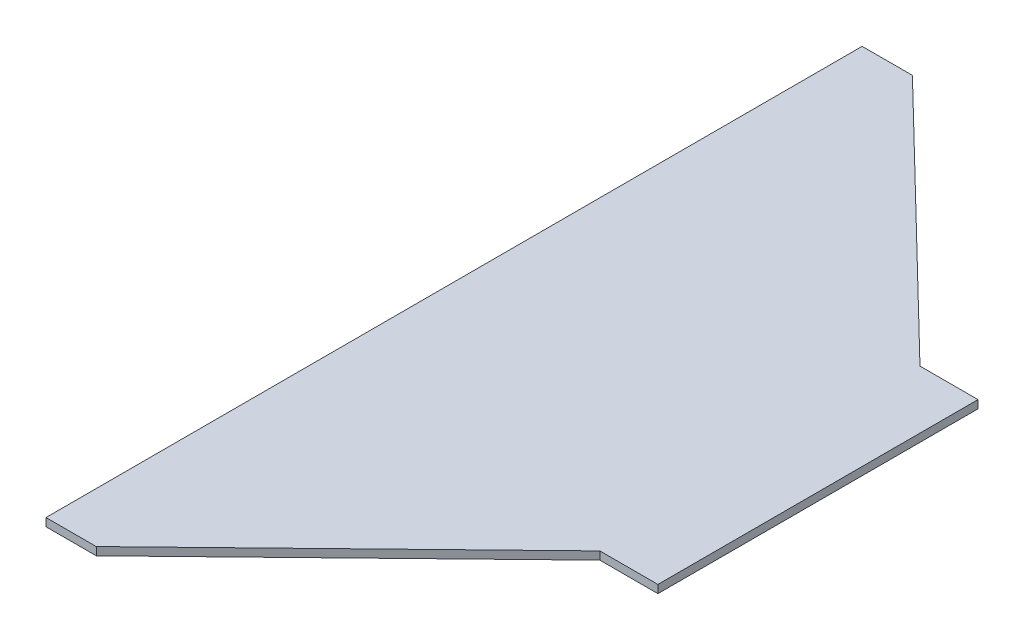
ISO-10303-21;
HEADER;
FILE_DESCRIPTION(('STEP AP214'),'2;1');
FILE_NAME('part.step','',(''),(''),'','','');
FILE_SCHEMA(('AUTOMOTIVE_DESIGN { 1 0 10303 214 1 1 1 1 }'));
ENDSEC;
DATA;
#1=APPLICATION_CONTEXT('core data for automotive mechanical design processes');
#2=APPLICATION_PROTOCOL_DEFINITION('international standard','automotive_design',2000,#1);
#3=PRODUCT_CONTEXT('',#1,'mechanical');
#4=PRODUCT('Part','Part','',(#3));
#5=PRODUCT_RELATED_PRODUCT_CATEGORY('part','',(#4));
#6=PRODUCT_DEFINITION_FORMATION('','',#4);
#7=PRODUCT_DEFINITION_CONTEXT('part definition',#1,'design');
#8=PRODUCT_DEFINITION('design','',#6,#7);
#9=PRODUCT_DEFINITION_SHAPE('','',#8);
#10=(LENGTH_UNIT() NAMED_UNIT(*) SI_UNIT(.MILLI.,.METRE.));
#11=(NAMED_UNIT(*) PLANE_ANGLE_UNIT() SI_UNIT($,.RADIAN.));
#12=(NAMED_UNIT(*) SI_UNIT($,.STERADIAN.) SOLID_ANGLE_UNIT());
#13=UNCERTAINTY_MEASURE_WITH_UNIT(LENGTH_MEASURE(1.E-05),#10,'distance_accuracy_value','');
#14=(GEOMETRIC_REPRESENTATION_CONTEXT(3) GLOBAL_UNCERTAINTY_ASSIGNED_CONTEXT((#13)) GLOBAL_UNIT_ASSIGNED_CONTEXT((#10,
#11,#12)) REPRESENTATION_CONTEXT('',''));
#15=CARTESIAN_POINT('',(0.,0.,0.));
#16=DIRECTION('',(0.,0.,1.));
#17=DIRECTION('',(1.,0.,0.));
#18=AXIS2_PLACEMENT_3D('',#15,#16,#17);
#19=CARTESIAN_POINT('',(6.27,1.,0.));
#20=DIRECTION('',(0.,0.,1.));
#21=DIRECTION('',(1.,0.,0.));
#22=AXIS2_PLACEMENT_3D('',#19,#20,#21);
#23=PLANE('',#22);
#24=DIRECTION('',(-1.,0.,0.));
#25=VECTOR('',#24,1.);
#26=CARTESIAN_POINT('',(6.27,0.,0.));
#27=LINE('',#26,#25);
#28=CARTESIAN_POINT('',(6.27,0.,0.));
#29=VERTEX_POINT('',#28);
#30=CARTESIAN_POINT('',(0.,0.,0.));
#31=VERTEX_POINT('',#30);
#32=EDGE_CURVE('E134',#29,#31,#27,.T.);
#33=ORIENTED_EDGE('',*,*,#32,.T.);
#34=DIRECTION('',(0.,-1.,0.));
#35=VECTOR('',#34,1.);
#36=CARTESIAN_POINT('',(0.,1.,0.));
#37=LINE('',#36,#35);
#38=CARTESIAN_POINT('',(0.,1.,0.));
#39=VERTEX_POINT('',#38);
#40=EDGE_CURVE('E11',#39,#31,#37,.T.);
#41=ORIENTED_EDGE('',*,*,#40,.F.);
#42=DIRECTION('',(-1.,0.,0.));
#43=VECTOR('',#42,1.);
#44=CARTESIAN_POINT('',(6.27,1.,0.));
#45=LINE('',#44,#43);
#46=CARTESIAN_POINT('',(6.27,1.,0.));
#47=VERTEX_POINT('',#46);
#48=EDGE_CURVE('E149',#47,#39,#45,.T.);
#49=ORIENTED_EDGE('',*,*,#48,.F.);
#50=DIRECTION('',(0.,-1.,0.));
#51=VECTOR('',#50,1.);
#52=CARTESIAN_POINT('',(6.27,1.,0.));
#53=LINE('',#52,#51);
#54=EDGE_CURVE('E131',#47,#29,#53,.T.);
#55=ORIENTED_EDGE('',*,*,#54,.T.);
#56=EDGE_LOOP('',(#33,#41,#49,#55));
#57=FACE_BOUND('',#56,.T.);
#58=ADVANCED_FACE('F39',(#57),#23,.F.);
#59=CARTESIAN_POINT('',(0.,1.,0.));
#60=DIRECTION('',(1.,0.,0.));
#61=DIRECTION('',(0.,0.,-1.));
#62=AXIS2_PLACEMENT_3D('',#59,#60,#61);
#63=PLANE('',#62);
#64=DIRECTION('',(0.,0.,1.));
#65=VECTOR('',#64,1.);
#66=CARTESIAN_POINT('',(0.,0.,0.));
#67=LINE('',#66,#65);
#68=CARTESIAN_POINT('',(0.,0.,101.83));
#69=VERTEX_POINT('',#68);
#70=EDGE_CURVE('E137',#31,#69,#67,.T.);
#71=ORIENTED_EDGE('',*,*,#70,.T.);
#72=DIRECTION('',(0.,-1.,0.));
#73=VECTOR('',#72,1.);
#74=CARTESIAN_POINT('',(0.,1.,101.83));
#75=LINE('',#74,#73);
#76=CARTESIAN_POINT('',(0.,1.,101.83));
#77=VERTEX_POINT('',#76);
#78=EDGE_CURVE('E50',#77,#69,#75,.T.);
#79=ORIENTED_EDGE('',*,*,#78,.F.);
#80=DIRECTION('',(0.,0.,1.));
#81=VECTOR('',#80,1.);
#82=CARTESIAN_POINT('',(0.,1.,0.));
#83=LINE('',#82,#81);
#84=EDGE_CURVE('E98',#39,#77,#83,.T.);
#85=ORIENTED_EDGE('',*,*,#84,.F.);
#86=ORIENTED_EDGE('',*,*,#40,.T.);
#87=EDGE_LOOP('',(#71,#79,#85,#86));
#88=FACE_BOUND('',#87,.T.);
#89=ADVANCED_FACE('F184',(#88),#63,.F.);
#90=CARTESIAN_POINT('',(0.,1.,101.83));
#91=DIRECTION('',(0.,0.,-1.));
#92=DIRECTION('',(-1.,0.,0.));
#93=AXIS2_PLACEMENT_3D('',#90,#91,#92);
#94=PLANE('',#93);
#95=DIRECTION('',(1.,0.,0.));
#96=VECTOR('',#95,1.);
#97=CARTESIAN_POINT('',(0.,0.,101.83));
#98=LINE('',#97,#96);
#99=CARTESIAN_POINT('',(6.27,0.,101.83));
#100=VERTEX_POINT('',#99);
#101=EDGE_CURVE('E139',#69,#100,#98,.T.);
#102=ORIENTED_EDGE('',*,*,#101,.T.);
#103=DIRECTION('',(0.,-1.,0.));
#104=VECTOR('',#103,1.);
#105=CARTESIAN_POINT('',(6.27,1.,101.83));
#106=LINE('',#105,#104);
#107=CARTESIAN_POINT('',(6.27,1.,101.83));
#108=VERTEX_POINT('',#107);
#109=EDGE_CURVE('E156',#108,#100,#106,.T.);
#110=ORIENTED_EDGE('',*,*,#109,.F.);
#111=DIRECTION('',(1.,0.,0.));
#112=VECTOR('',#111,1.);
#113=CARTESIAN_POINT('',(0.,1.,101.83));
#114=LINE('',#113,#112);
#115=EDGE_CURVE('E163',#77,#108,#114,.T.);
#116=ORIENTED_EDGE('',*,*,#115,.F.);
#117=ORIENTED_EDGE('',*,*,#78,.T.);
#118=EDGE_LOOP('',(#102,#110,#116,#117));
#119=FACE_BOUND('',#118,.T.);
#120=ADVANCED_FACE('F165',(#119),#94,.F.);
#121=CARTESIAN_POINT('',(6.27,1.,101.83));
#122=DIRECTION('',(-0.696393575510658,0.,-0.717660078301337));
#123=DIRECTION('',(-0.717660078301337,0.,0.696393575510658));
#124=AXIS2_PLACEMENT_3D('',#121,#122,#123);
#125=PLANE('',#124);
#126=DIRECTION('',(0.717660078301337,0.,-0.696393575510658));
#127=VECTOR('',#126,1.);
#128=CARTESIAN_POINT('',(6.27,0.,101.83));
#129=LINE('',#128,#127);
#130=CARTESIAN_POINT('',(38.16,0.,70.885));
#131=VERTEX_POINT('',#130);
#132=EDGE_CURVE('E142',#100,#131,#129,.T.);
#133=ORIENTED_EDGE('',*,*,#132,.T.);
#134=DIRECTION('',(0.,-1.,0.));
#135=VECTOR('',#134,1.);
#136=CARTESIAN_POINT('',(38.16,1.,70.885));
#137=LINE('',#136,#135);
#138=CARTESIAN_POINT('',(38.16,1.,70.885));
#139=VERTEX_POINT('',#138);
#140=EDGE_CURVE('E153',#139,#131,#137,.T.);
#141=ORIENTED_EDGE('',*,*,#140,.F.);
#142=DIRECTION('',(0.717660078301337,0.,-0.696393575510658));
#143=VECTOR('',#142,1.);
#144=CARTESIAN_POINT('',(6.27,1.,101.83));
#145=LINE('',#144,#143);
#146=EDGE_CURVE('E176',#108,#139,#145,.T.);
#147=ORIENTED_EDGE('',*,*,#146,.F.);
#148=ORIENTED_EDGE('',*,*,#109,.T.);
#149=EDGE_LOOP('',(#133,#141,#147,#148));
#150=FACE_BOUND('',#149,.T.);
#151=ADVANCED_FACE('F175',(#150),#125,.F.);
#152=CARTESIAN_POINT('',(38.16,1.,70.885));
#153=DIRECTION('',(0.,0.,-1.));
#154=DIRECTION('',(-1.,0.,0.));
#155=AXIS2_PLACEMENT_3D('',#152,#153,#154);
#156=PLANE('',#155);
#157=DIRECTION('',(1.,0.,0.));
#158=VECTOR('',#157,1.);
#159=CARTESIAN_POINT('',(38.16,0.,70.885));
#160=LINE('',#159,#158);
#161=CARTESIAN_POINT('',(45.4,0.,70.885));
#162=VERTEX_POINT('',#161);
#163=EDGE_CURVE('E145',#131,#162,#160,.T.);
#164=ORIENTED_EDGE('',*,*,#163,.T.);
#165=DIRECTION('',(0.,-1.,0.));
#166=VECTOR('',#165,1.);
#167=CARTESIAN_POINT('',(45.4,1.,70.885));
#168=LINE('',#167,#166);
#169=CARTESIAN_POINT('',(45.4,1.,70.885));
#170=VERTEX_POINT('',#169);
#171=EDGE_CURVE('E127',#170,#162,#168,.T.);
#172=ORIENTED_EDGE('',*,*,#171,.F.);
#173=DIRECTION('',(1.,0.,0.));
#174=VECTOR('',#173,1.);
#175=CARTESIAN_POINT('',(38.16,1.,70.885));
#176=LINE('',#175,#174);
#177=EDGE_CURVE('E120',#139,#170,#176,.T.);
#178=ORIENTED_EDGE('',*,*,#177,.F.);
#179=ORIENTED_EDGE('',*,*,#140,.T.);
#180=EDGE_LOOP('',(#164,#172,#178,#179));
#181=FACE_BOUND('',#180,.T.);
#182=ADVANCED_FACE('F174',(#181),#156,.F.);
#183=CARTESIAN_POINT('',(45.4,1.,70.885));
#184=DIRECTION('',(-1.,0.,0.));
#185=DIRECTION('',(0.,0.,1.));
#186=AXIS2_PLACEMENT_3D('',#183,#184,#185);
#187=PLANE('',#186);
#188=DIRECTION('',(0.,0.,-1.));
#189=VECTOR('',#188,1.);
#190=CARTESIAN_POINT('',(45.4,0.,70.885));
#191=LINE('',#190,#189);
#192=CARTESIAN_POINT('',(45.4,0.,30.945));
#193=VERTEX_POINT('',#192);
#194=EDGE_CURVE('E124',#162,#193,#191,.T.);
#195=ORIENTED_EDGE('',*,*,#194,.T.);
#196=DIRECTION('',(0.,-1.,0.));
#197=VECTOR('',#196,1.);
#198=CARTESIAN_POINT('',(45.4,1.,30.945));
#199=LINE('',#198,#197);
#200=CARTESIAN_POINT('',(45.4,1.,30.945));
#201=VERTEX_POINT('',#200);
#202=EDGE_CURVE('E125',#201,#193,#199,.T.);
#203=ORIENTED_EDGE('',*,*,#202,.F.);
#204=DIRECTION('',(0.,0.,-1.));
#205=VECTOR('',#204,1.);
#206=CARTESIAN_POINT('',(45.4,1.,70.885));
#207=LINE('',#206,#205);
#208=EDGE_CURVE('E112',#170,#201,#207,.T.);
#209=ORIENTED_EDGE('',*,*,#208,.F.);
#210=ORIENTED_EDGE('',*,*,#171,.T.);
#211=EDGE_LOOP('',(#195,#203,#209,#210));
#212=FACE_BOUND('',#211,.T.);
#213=ADVANCED_FACE('F122',(#212),#187,.F.);
#214=CARTESIAN_POINT('',(45.4,1.,30.945));
#215=DIRECTION('',(0.,0.,1.));
#216=DIRECTION('',(1.,0.,0.));
#217=AXIS2_PLACEMENT_3D('',#214,#215,#216);
#218=PLANE('',#217);
#219=DIRECTION('',(-1.,0.,0.));
#220=VECTOR('',#219,1.);
#221=CARTESIAN_POINT('',(45.4,0.,30.945));
#222=LINE('',#221,#220);
#223=CARTESIAN_POINT('',(38.16,0.,30.945));
#224=VERTEX_POINT('',#223);
#225=EDGE_CURVE('E83',#193,#224,#222,.T.);
#226=ORIENTED_EDGE('',*,*,#225,.T.);
#227=DIRECTION('',(0.,-1.,0.));
#228=VECTOR('',#227,1.);
#229=CARTESIAN_POINT('',(38.16,1.,30.945));
#230=LINE('',#229,#228);
#231=CARTESIAN_POINT('',(38.16,1.,30.945));
#232=VERTEX_POINT('',#231);
#233=EDGE_CURVE('E130',#232,#224,#230,.T.);
#234=ORIENTED_EDGE('',*,*,#233,.F.);
#235=DIRECTION('',(-1.,0.,0.));
#236=VECTOR('',#235,1.);
#237=CARTESIAN_POINT('',(45.4,1.,30.945));
#238=LINE('',#237,#236);
#239=EDGE_CURVE('E113',#201,#232,#238,.T.);
#240=ORIENTED_EDGE('',*,*,#239,.F.);
#241=ORIENTED_EDGE('',*,*,#202,.T.);
#242=EDGE_LOOP('',(#226,#234,#240,#241));
#243=FACE_BOUND('',#242,.T.);
#244=ADVANCED_FACE('F129',(#243),#218,.F.);
#245=CARTESIAN_POINT('',(38.16,1.,30.945));
#246=DIRECTION('',(-0.696393575510658,0.,0.717660078301337));
#247=DIRECTION('',(0.717660078301337,0.,0.696393575510658));
#248=AXIS2_PLACEMENT_3D('',#245,#246,#247);
#249=PLANE('',#248);
#250=DIRECTION('',(-0.717660078301337,0.,-0.696393575510658));
#251=VECTOR('',#250,1.);
#252=CARTESIAN_POINT('',(38.16,0.,30.945));
#253=LINE('',#252,#251);
#254=EDGE_CURVE('E89',#224,#29,#253,.T.);
#255=ORIENTED_EDGE('',*,*,#254,.T.);
#256=ORIENTED_EDGE('',*,*,#54,.F.);
#257=DIRECTION('',(-0.717660078301337,0.,-0.696393575510658));
#258=VECTOR('',#257,1.);
#259=CARTESIAN_POINT('',(38.16,1.,30.945));
#260=LINE('',#259,#258);
#261=EDGE_CURVE('E54',#232,#47,#260,.T.);
#262=ORIENTED_EDGE('',*,*,#261,.F.);
#263=ORIENTED_EDGE('',*,*,#233,.T.);
#264=EDGE_LOOP('',(#255,#256,#262,#263));
#265=FACE_BOUND('',#264,.T.);
#266=ADVANCED_FACE('F199',(#265),#249,.F.);
#267=CARTESIAN_POINT('',(0.,1.,0.));
#268=DIRECTION('',(0.,1.,0.));
#269=DIRECTION('',(0.,0.,1.));
#270=AXIS2_PLACEMENT_3D('',#267,#268,#269);
#271=PLANE('',#270);
#272=ORIENTED_EDGE('',*,*,#48,.T.);
#273=ORIENTED_EDGE('',*,*,#84,.T.);
#274=ORIENTED_EDGE('',*,*,#115,.T.);
#275=ORIENTED_EDGE('',*,*,#146,.T.);
#276=ORIENTED_EDGE('',*,*,#177,.T.);
#277=ORIENTED_EDGE('',*,*,#208,.T.);
#278=ORIENTED_EDGE('',*,*,#239,.T.);
#279=ORIENTED_EDGE('',*,*,#261,.T.);
#280=EDGE_LOOP('',(#272,#273,#274,#275,#276,#277,#278,#279));
#281=FACE_BOUND('',#280,.T.);
#282=ADVANCED_FACE('F114',(#281),#271,.T.);
#283=CARTESIAN_POINT('',(0.,0.,0.));
#284=DIRECTION('',(0.,1.,0.));
#285=DIRECTION('',(0.,0.,1.));
#286=AXIS2_PLACEMENT_3D('',#283,#284,#285);
#287=PLANE('',#286);
#288=ORIENTED_EDGE('',*,*,#32,.F.);
#289=ORIENTED_EDGE('',*,*,#254,.F.);
#290=ORIENTED_EDGE('',*,*,#225,.F.);
#291=ORIENTED_EDGE('',*,*,#194,.F.);
#292=ORIENTED_EDGE('',*,*,#163,.F.);
#293=ORIENTED_EDGE('',*,*,#132,.F.);
#294=ORIENTED_EDGE('',*,*,#101,.F.);
#295=ORIENTED_EDGE('',*,*,#70,.F.);
#296=EDGE_LOOP('',(#288,#289,#290,#291,#292,#293,#294,#295));
#297=FACE_BOUND('',#296,.T.);
#298=ADVANCED_FACE('F169',(#297),#287,.F.);
#299=CLOSED_SHELL('',(#58,#89,#120,#151,#182,#213,#244,#266,#282,#298));
#300=MANIFOLD_SOLID_BREP('B2',#299);
#301=ADVANCED_BREP_SHAPE_REPRESENTATION('',(#18,#300),#14);
#302=SHAPE_DEFINITION_REPRESENTATION(#9,#301);
ENDSEC;
END-ISO-10303-21;
